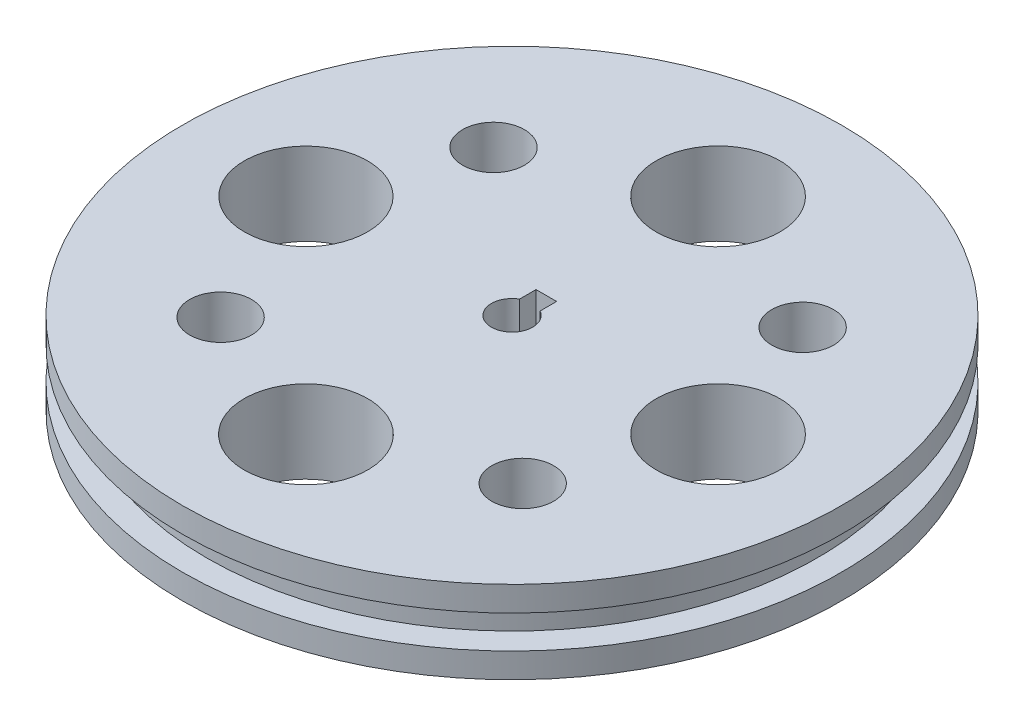
ISO-10303-21;
HEADER;
FILE_DESCRIPTION(('STEP AP214'),'2;1');
FILE_NAME('part.step','',(''),(''),'','','');
FILE_SCHEMA(('AUTOMOTIVE_DESIGN { 1 0 10303 214 1 1 1 1 }'));
ENDSEC;
DATA;
#1=APPLICATION_CONTEXT('core data for automotive mechanical design processes');
#2=APPLICATION_PROTOCOL_DEFINITION('international standard','automotive_design',2000,#1);
#3=PRODUCT_CONTEXT('',#1,'mechanical');
#4=PRODUCT('Part','Part','',(#3));
#5=PRODUCT_RELATED_PRODUCT_CATEGORY('part','',(#4));
#6=PRODUCT_DEFINITION_FORMATION('','',#4);
#7=PRODUCT_DEFINITION_CONTEXT('part definition',#1,'design');
#8=PRODUCT_DEFINITION('design','',#6,#7);
#9=PRODUCT_DEFINITION_SHAPE('','',#8);
#10=(LENGTH_UNIT() NAMED_UNIT(*) SI_UNIT(.MILLI.,.METRE.));
#11=(NAMED_UNIT(*) PLANE_ANGLE_UNIT() SI_UNIT($,.RADIAN.));
#12=(NAMED_UNIT(*) SI_UNIT($,.STERADIAN.) SOLID_ANGLE_UNIT());
#13=UNCERTAINTY_MEASURE_WITH_UNIT(LENGTH_MEASURE(1.E-05),#10,'distance_accuracy_value','');
#14=(GEOMETRIC_REPRESENTATION_CONTEXT(3) GLOBAL_UNCERTAINTY_ASSIGNED_CONTEXT((#13)) GLOBAL_UNIT_ASSIGNED_CONTEXT((#10,
#11,#12)) REPRESENTATION_CONTEXT('',''));
#15=CARTESIAN_POINT('',(0.,0.,0.));
#16=DIRECTION('',(0.,0.,1.));
#17=DIRECTION('',(1.,0.,0.));
#18=AXIS2_PLACEMENT_3D('',#15,#16,#17);
#19=CARTESIAN_POINT('',(0.,0.,0.));
#20=DIRECTION('',(0.,1.,0.));
#21=DIRECTION('',(0.,0.,1.));
#22=AXIS2_PLACEMENT_3D('',#19,#20,#21);
#23=PLANE('',#22);
#24=CARTESIAN_POINT('',(-44.3867054724508,0.,45.4100250748875));
#25=DIRECTION('',(0.,1.,0.));
#26=DIRECTION('',(0.,0.,1.));
#27=AXIS2_PLACEMENT_3D('',#24,#25,#26);
#28=CIRCLE('',#27,9.525);
#29=CARTESIAN_POINT('',(-44.3867054724508,0.,54.9350250748874));
#30=VERTEX_POINT('',#29);
#31=EDGE_CURVE('E148',#30,#30,#28,.T.);
#32=ORIENTED_EDGE('',*,*,#31,.T.);
#33=EDGE_LOOP('',(#32));
#34=FACE_BOUND('',#33,.T.);
#35=CARTESIAN_POINT('',(0.,0.,63.5));
#36=DIRECTION('',(0.,1.,0.));
#37=DIRECTION('',(0.,0.,1.));
#38=AXIS2_PLACEMENT_3D('',#35,#36,#37);
#39=CIRCLE('',#38,19.05);
#40=CARTESIAN_POINT('',(0.,0.,82.55));
#41=VERTEX_POINT('',#40);
#42=EDGE_CURVE('E142',#41,#41,#39,.T.);
#43=ORIENTED_EDGE('',*,*,#42,.T.);
#44=EDGE_LOOP('',(#43));
#45=FACE_BOUND('',#44,.T.);
#46=DIRECTION('',(1.,0.,0.));
#47=VECTOR('',#46,1.);
#48=CARTESIAN_POINT('',(-3.17500000000001,0.,-10.5808965722947));
#49=LINE('',#48,#47);
#50=CARTESIAN_POINT('',(-3.17500000000001,0.,-10.5808965722947));
#51=VERTEX_POINT('',#50);
#52=CARTESIAN_POINT('',(3.17499999999999,0.,-10.5808965722947));
#53=VERTEX_POINT('',#52);
#54=EDGE_CURVE('E131',#51,#53,#49,.T.);
#55=ORIENTED_EDGE('',*,*,#54,.F.);
#56=DIRECTION('',(0.,0.,1.));
#57=VECTOR('',#56,1.);
#58=CARTESIAN_POINT('',(-3.17500000000001,0.,-10.5808965722947));
#59=LINE('',#58,#57);
#60=CARTESIAN_POINT('',(-3.17500000000001,0.,-5.49926131403118));
#61=VERTEX_POINT('',#60);
#62=EDGE_CURVE('E115',#51,#61,#59,.T.);
#63=ORIENTED_EDGE('',*,*,#62,.T.);
#64=CARTESIAN_POINT('',(0.,0.,0.));
#65=DIRECTION('',(0.,1.,0.));
#66=DIRECTION('',(0.,0.,1.));
#67=AXIS2_PLACEMENT_3D('',#64,#65,#66);
#68=CIRCLE('',#67,6.35);
#69=CARTESIAN_POINT('',(3.17499999999999,0.,-5.49926131403119));
#70=VERTEX_POINT('',#69);
#71=EDGE_CURVE('E124',#61,#70,#68,.T.);
#72=ORIENTED_EDGE('',*,*,#71,.T.);
#73=DIRECTION('',(0.,0.,1.));
#74=VECTOR('',#73,1.);
#75=CARTESIAN_POINT('',(3.17499999999999,0.,-10.5808965722947));
#76=LINE('',#75,#74);
#77=EDGE_CURVE('E86',#53,#70,#76,.T.);
#78=ORIENTED_EDGE('',*,*,#77,.F.);
#79=EDGE_LOOP('',(#55,#63,#72,#78));
#80=FACE_BOUND('',#79,.T.);
#81=CARTESIAN_POINT('',(47.9972072686744,0.,-41.5754506218262));
#82=DIRECTION('',(0.,1.,0.));
#83=DIRECTION('',(0.,0.,1.));
#84=AXIS2_PLACEMENT_3D('',#81,#82,#83);
#85=CIRCLE('',#84,9.525);
#86=CARTESIAN_POINT('',(47.9972072686744,0.,-32.0504506218263));
#87=VERTEX_POINT('',#86);
#88=EDGE_CURVE('E305',#87,#87,#85,.T.);
#89=ORIENTED_EDGE('',*,*,#88,.T.);
#90=EDGE_LOOP('',(#89));
#91=FACE_BOUND('',#90,.T.);
#92=CARTESIAN_POINT('',(63.5,0.,0.));
#93=DIRECTION('',(0.,1.,0.));
#94=DIRECTION('',(0.,0.,1.));
#95=AXIS2_PLACEMENT_3D('',#92,#93,#94);
#96=CIRCLE('',#95,19.05);
#97=CARTESIAN_POINT('',(63.5,0.,19.05));
#98=VERTEX_POINT('',#97);
#99=EDGE_CURVE('E173',#98,#98,#96,.T.);
#100=ORIENTED_EDGE('',*,*,#99,.T.);
#101=EDGE_LOOP('',(#100));
#102=FACE_BOUND('',#101,.T.);
#103=CARTESIAN_POINT('',(-63.5,0.,0.));
#104=DIRECTION('',(0.,1.,0.));
#105=DIRECTION('',(0.,0.,1.));
#106=AXIS2_PLACEMENT_3D('',#103,#104,#105);
#107=CIRCLE('',#106,18.9883305788282);
#108=CARTESIAN_POINT('',(-63.5,0.,18.9883305788282));
#109=VERTEX_POINT('',#108);
#110=EDGE_CURVE('E167',#109,#109,#107,.T.);
#111=ORIENTED_EDGE('',*,*,#110,.T.);
#112=EDGE_LOOP('',(#111));
#113=FACE_BOUND('',#112,.T.);
#114=CARTESIAN_POINT('',(-47.6598592977243,0.,-41.9617422388671));
#115=DIRECTION('',(0.,1.,0.));
#116=DIRECTION('',(0.,0.,1.));
#117=AXIS2_PLACEMENT_3D('',#114,#115,#116);
#118=CIRCLE('',#117,9.525);
#119=CARTESIAN_POINT('',(-47.6598592977243,0.,-32.4367422388671));
#120=VERTEX_POINT('',#119);
#121=EDGE_CURVE('E161',#120,#120,#118,.T.);
#122=ORIENTED_EDGE('',*,*,#121,.T.);
#123=EDGE_LOOP('',(#122));
#124=FACE_BOUND('',#123,.T.);
#125=CARTESIAN_POINT('',(0.,0.,-63.5));
#126=DIRECTION('',(0.,1.,0.));
#127=DIRECTION('',(0.,0.,1.));
#128=AXIS2_PLACEMENT_3D('',#125,#126,#127);
#129=CIRCLE('',#128,19.05);
#130=CARTESIAN_POINT('',(0.,0.,-44.45));
#131=VERTEX_POINT('',#130);
#132=EDGE_CURVE('E155',#131,#131,#129,.T.);
#133=ORIENTED_EDGE('',*,*,#132,.T.);
#134=EDGE_LOOP('',(#133));
#135=FACE_BOUND('',#134,.T.);
#136=CARTESIAN_POINT('',(46.5214875325729,0.,43.2203794263385));
#137=DIRECTION('',(0.,1.,0.));
#138=DIRECTION('',(0.,0.,1.));
#139=AXIS2_PLACEMENT_3D('',#136,#137,#138);
#140=CIRCLE('',#139,9.5250000000001);
#141=CARTESIAN_POINT('',(46.5214875325729,0.,52.7453794263386));
#142=VERTEX_POINT('',#141);
#143=EDGE_CURVE('E177',#142,#142,#140,.T.);
#144=ORIENTED_EDGE('',*,*,#143,.T.);
#145=EDGE_LOOP('',(#144));
#146=FACE_BOUND('',#145,.T.);
#147=CARTESIAN_POINT('',(0.,0.,0.));
#148=DIRECTION('',(0.,1.,0.));
#149=DIRECTION('',(0.,0.,1.));
#150=AXIS2_PLACEMENT_3D('',#147,#148,#149);
#151=CIRCLE('',#150,101.558930414115);
#152=CARTESIAN_POINT('',(0.,0.,101.558930414115));
#153=VERTEX_POINT('',#152);
#154=EDGE_CURVE('E12',#153,#153,#151,.T.);
#155=ORIENTED_EDGE('',*,*,#154,.F.);
#156=EDGE_LOOP('',(#155));
#157=FACE_BOUND('',#156,.T.);
#158=ADVANCED_FACE('F72',(#34,#45,#80,#91,#102,#113,#124,#135,#146,#157),#23,.F.);
#159=CARTESIAN_POINT('',(0.,25.4486414958803,0.));
#160=DIRECTION('',(0.,1.,0.));
#161=DIRECTION('',(0.,0.,1.));
#162=AXIS2_PLACEMENT_3D('',#159,#160,#161);
#163=CYLINDRICAL_SURFACE('',#162,101.558930414115);
#164=CARTESIAN_POINT('',(0.,7.65815600570473,0.));
#165=DIRECTION('',(0.,1.,0.));
#166=DIRECTION('',(0.,0.,1.));
#167=AXIS2_PLACEMENT_3D('',#164,#165,#166);
#168=CIRCLE('',#167,101.558930414115);
#169=CARTESIAN_POINT('',(0.,7.65815600570473,101.558930414115));
#170=VERTEX_POINT('',#169);
#171=EDGE_CURVE('E79',#170,#170,#168,.T.);
#172=ORIENTED_EDGE('',*,*,#171,.F.);
#173=EDGE_LOOP('',(#172));
#174=FACE_BOUND('',#173,.T.);
#175=ORIENTED_EDGE('',*,*,#154,.T.);
#176=EDGE_LOOP('',(#175));
#177=FACE_BOUND('',#176,.T.);
#178=ADVANCED_FACE('F198',(#174,#177),#163,.T.);
#179=CARTESIAN_POINT('',(101.558930414115,7.65815600570473,0.));
#180=DIRECTION('',(0.,-1.,0.));
#181=DIRECTION('',(0.,0.,-1.));
#182=AXIS2_PLACEMENT_3D('',#179,#180,#181);
#183=PLANE('',#182);
#184=CARTESIAN_POINT('',(0.,7.65815600570473,0.));
#185=DIRECTION('',(0.,1.,0.));
#186=DIRECTION('',(0.,0.,1.));
#187=AXIS2_PLACEMENT_3D('',#184,#185,#186);
#188=CIRCLE('',#187,94.0185921931134);
#189=CARTESIAN_POINT('',(0.,7.65815600570473,94.0185921931134));
#190=VERTEX_POINT('',#189);
#191=EDGE_CURVE('E191',#190,#190,#188,.T.);
#192=ORIENTED_EDGE('',*,*,#191,.F.);
#193=EDGE_LOOP('',(#192));
#194=FACE_BOUND('',#193,.T.);
#195=ORIENTED_EDGE('',*,*,#171,.T.);
#196=EDGE_LOOP('',(#195));
#197=FACE_BOUND('',#196,.T.);
#198=ADVANCED_FACE('F196',(#194,#197),#183,.F.);
#199=CARTESIAN_POINT('',(0.,25.4486414958803,0.));
#200=DIRECTION('',(0.,1.,0.));
#201=DIRECTION('',(0.,0.,1.));
#202=AXIS2_PLACEMENT_3D('',#199,#200,#201);
#203=CYLINDRICAL_SURFACE('',#202,94.0185921931134);
#204=CARTESIAN_POINT('',(0.,17.7904854901756,0.));
#205=DIRECTION('',(0.,1.,0.));
#206=DIRECTION('',(0.,0.,1.));
#207=AXIS2_PLACEMENT_3D('',#204,#205,#206);
#208=CIRCLE('',#207,94.0185921931134);
#209=CARTESIAN_POINT('',(0.,17.7904854901756,94.0185921931134));
#210=VERTEX_POINT('',#209);
#211=EDGE_CURVE('E188',#210,#210,#208,.T.);
#212=ORIENTED_EDGE('',*,*,#211,.F.);
#213=EDGE_LOOP('',(#212));
#214=FACE_BOUND('',#213,.T.);
#215=ORIENTED_EDGE('',*,*,#191,.T.);
#216=EDGE_LOOP('',(#215));
#217=FACE_BOUND('',#216,.T.);
#218=ADVANCED_FACE('F250',(#214,#217),#203,.T.);
#219=CARTESIAN_POINT('',(94.0185921931134,17.7904854901756,0.));
#220=DIRECTION('',(0.,1.,0.));
#221=DIRECTION('',(0.,0.,1.));
#222=AXIS2_PLACEMENT_3D('',#219,#220,#221);
#223=PLANE('',#222);
#224=CARTESIAN_POINT('',(0.,17.7904854901756,0.));
#225=DIRECTION('',(0.,1.,0.));
#226=DIRECTION('',(0.,0.,1.));
#227=AXIS2_PLACEMENT_3D('',#224,#225,#226);
#228=CIRCLE('',#227,101.558930414115);
#229=CARTESIAN_POINT('',(0.,17.7904854901756,101.558930414115));
#230=VERTEX_POINT('',#229);
#231=EDGE_CURVE('E185',#230,#230,#228,.T.);
#232=ORIENTED_EDGE('',*,*,#231,.F.);
#233=EDGE_LOOP('',(#232));
#234=FACE_BOUND('',#233,.T.);
#235=ORIENTED_EDGE('',*,*,#211,.T.);
#236=EDGE_LOOP('',(#235));
#237=FACE_BOUND('',#236,.T.);
#238=ADVANCED_FACE('F244',(#234,#237),#223,.F.);
#239=CARTESIAN_POINT('',(0.,25.4486414958803,0.));
#240=DIRECTION('',(0.,1.,0.));
#241=DIRECTION('',(0.,0.,1.));
#242=AXIS2_PLACEMENT_3D('',#239,#240,#241);
#243=CYLINDRICAL_SURFACE('',#242,101.558930414115);
#244=CARTESIAN_POINT('',(0.,25.4486414958803,0.));
#245=DIRECTION('',(0.,1.,0.));
#246=DIRECTION('',(0.,0.,1.));
#247=AXIS2_PLACEMENT_3D('',#244,#245,#246);
#248=CIRCLE('',#247,101.558930414115);
#249=CARTESIAN_POINT('',(0.,25.4486414958803,101.558930414115));
#250=VERTEX_POINT('',#249);
#251=EDGE_CURVE('E180',#250,#250,#248,.T.);
#252=ORIENTED_EDGE('',*,*,#251,.F.);
#253=EDGE_LOOP('',(#252));
#254=FACE_BOUND('',#253,.T.);
#255=ORIENTED_EDGE('',*,*,#231,.T.);
#256=EDGE_LOOP('',(#255));
#257=FACE_BOUND('',#256,.T.);
#258=ADVANCED_FACE('F222',(#254,#257),#243,.T.);
#259=CARTESIAN_POINT('',(101.558930414115,25.4486414958803,0.));
#260=DIRECTION('',(0.,-1.,0.));
#261=DIRECTION('',(0.,0.,-1.));
#262=AXIS2_PLACEMENT_3D('',#259,#260,#261);
#263=PLANE('',#262);
#264=CARTESIAN_POINT('',(-44.3867054724508,25.4486414958803,45.4100250748875));
#265=DIRECTION('',(0.,1.,0.));
#266=DIRECTION('',(0.,0.,1.));
#267=AXIS2_PLACEMENT_3D('',#264,#265,#266);
#268=CIRCLE('',#267,9.525);
#269=CARTESIAN_POINT('',(-44.3867054724508,25.4486414958803,54.9350250748874));
#270=VERTEX_POINT('',#269);
#271=EDGE_CURVE('E145',#270,#270,#268,.T.);
#272=ORIENTED_EDGE('',*,*,#271,.F.);
#273=EDGE_LOOP('',(#272));
#274=FACE_BOUND('',#273,.T.);
#275=CARTESIAN_POINT('',(0.,25.4486414958803,63.5));
#276=DIRECTION('',(0.,1.,0.));
#277=DIRECTION('',(0.,0.,1.));
#278=AXIS2_PLACEMENT_3D('',#275,#276,#277);
#279=CIRCLE('',#278,19.05);
#280=CARTESIAN_POINT('',(0.,25.4486414958803,82.55));
#281=VERTEX_POINT('',#280);
#282=EDGE_CURVE('E139',#281,#281,#279,.T.);
#283=ORIENTED_EDGE('',*,*,#282,.F.);
#284=EDGE_LOOP('',(#283));
#285=FACE_BOUND('',#284,.T.);
#286=CARTESIAN_POINT('',(0.,25.4486414958803,0.));
#287=DIRECTION('',(0.,1.,0.));
#288=DIRECTION('',(0.,0.,1.));
#289=AXIS2_PLACEMENT_3D('',#286,#287,#288);
#290=CIRCLE('',#289,6.35);
#291=CARTESIAN_POINT('',(-3.17500000000001,25.4486414958803,-5.49926131403118));
#292=VERTEX_POINT('',#291);
#293=CARTESIAN_POINT('',(3.17499999999999,25.4486414958803,-5.49926131403119));
#294=VERTEX_POINT('',#293);
#295=EDGE_CURVE('E127',#292,#294,#290,.T.);
#296=ORIENTED_EDGE('',*,*,#295,.F.);
#297=DIRECTION('',(0.,0.,1.));
#298=VECTOR('',#297,1.);
#299=CARTESIAN_POINT('',(-3.17500000000001,25.4486414958803,-10.5808965722947));
#300=LINE('',#299,#298);
#301=CARTESIAN_POINT('',(-3.17500000000001,25.4486414958803,-10.5808965722947));
#302=VERTEX_POINT('',#301);
#303=EDGE_CURVE('E94',#302,#292,#300,.T.);
#304=ORIENTED_EDGE('',*,*,#303,.F.);
#305=DIRECTION('',(1.,0.,0.));
#306=VECTOR('',#305,1.);
#307=CARTESIAN_POINT('',(-3.17500000000001,25.4486414958803,-10.5808965722947));
#308=LINE('',#307,#306);
#309=CARTESIAN_POINT('',(3.17499999999999,25.4486414958803,-10.5808965722947));
#310=VERTEX_POINT('',#309);
#311=EDGE_CURVE('E133',#302,#310,#308,.T.);
#312=ORIENTED_EDGE('',*,*,#311,.T.);
#313=DIRECTION('',(0.,0.,1.));
#314=VECTOR('',#313,1.);
#315=CARTESIAN_POINT('',(3.17499999999999,25.4486414958803,-10.5808965722947));
#316=LINE('',#315,#314);
#317=EDGE_CURVE('E128',#310,#294,#316,.T.);
#318=ORIENTED_EDGE('',*,*,#317,.T.);
#319=EDGE_LOOP('',(#296,#304,#312,#318));
#320=FACE_BOUND('',#319,.T.);
#321=CARTESIAN_POINT('',(47.9972072686744,25.4486414958803,-41.5754506218262));
#322=DIRECTION('',(0.,1.,0.));
#323=DIRECTION('',(0.,0.,1.));
#324=AXIS2_PLACEMENT_3D('',#321,#322,#323);
#325=CIRCLE('',#324,9.525);
#326=CARTESIAN_POINT('',(47.9972072686744,25.4486414958803,-32.0504506218263));
#327=VERTEX_POINT('',#326);
#328=EDGE_CURVE('E176',#327,#327,#325,.T.);
#329=ORIENTED_EDGE('',*,*,#328,.F.);
#330=EDGE_LOOP('',(#329));
#331=FACE_BOUND('',#330,.T.);
#332=CARTESIAN_POINT('',(63.5,25.4486414958803,0.));
#333=DIRECTION('',(0.,1.,0.));
#334=DIRECTION('',(0.,0.,1.));
#335=AXIS2_PLACEMENT_3D('',#332,#333,#334);
#336=CIRCLE('',#335,19.05);
#337=CARTESIAN_POINT('',(63.5,25.4486414958803,19.05));
#338=VERTEX_POINT('',#337);
#339=EDGE_CURVE('E170',#338,#338,#336,.T.);
#340=ORIENTED_EDGE('',*,*,#339,.F.);
#341=EDGE_LOOP('',(#340));
#342=FACE_BOUND('',#341,.T.);
#343=CARTESIAN_POINT('',(-63.5,25.4486414958803,0.));
#344=DIRECTION('',(0.,1.,0.));
#345=DIRECTION('',(0.,0.,1.));
#346=AXIS2_PLACEMENT_3D('',#343,#344,#345);
#347=CIRCLE('',#346,18.9883305788282);
#348=CARTESIAN_POINT('',(-63.5,25.4486414958803,18.9883305788282));
#349=VERTEX_POINT('',#348);
#350=EDGE_CURVE('E164',#349,#349,#347,.T.);
#351=ORIENTED_EDGE('',*,*,#350,.F.);
#352=EDGE_LOOP('',(#351));
#353=FACE_BOUND('',#352,.T.);
#354=CARTESIAN_POINT('',(-47.6598592977243,25.4486414958803,-41.9617422388671));
#355=DIRECTION('',(0.,1.,0.));
#356=DIRECTION('',(0.,0.,1.));
#357=AXIS2_PLACEMENT_3D('',#354,#355,#356);
#358=CIRCLE('',#357,9.525);
#359=CARTESIAN_POINT('',(-47.6598592977243,25.4486414958803,-32.4367422388671));
#360=VERTEX_POINT('',#359);
#361=EDGE_CURVE('E158',#360,#360,#358,.T.);
#362=ORIENTED_EDGE('',*,*,#361,.F.);
#363=EDGE_LOOP('',(#362));
#364=FACE_BOUND('',#363,.T.);
#365=CARTESIAN_POINT('',(0.,25.4486414958803,-63.5));
#366=DIRECTION('',(0.,1.,0.));
#367=DIRECTION('',(0.,0.,1.));
#368=AXIS2_PLACEMENT_3D('',#365,#366,#367);
#369=CIRCLE('',#368,19.05);
#370=CARTESIAN_POINT('',(0.,25.4486414958803,-44.45));
#371=VERTEX_POINT('',#370);
#372=EDGE_CURVE('E151',#371,#371,#369,.T.);
#373=ORIENTED_EDGE('',*,*,#372,.F.);
#374=EDGE_LOOP('',(#373));
#375=FACE_BOUND('',#374,.T.);
#376=CARTESIAN_POINT('',(46.5214875325729,25.4486414958803,43.2203794263385));
#377=DIRECTION('',(0.,1.,0.));
#378=DIRECTION('',(0.,0.,1.));
#379=AXIS2_PLACEMENT_3D('',#376,#377,#378);
#380=CIRCLE('',#379,9.5250000000001);
#381=CARTESIAN_POINT('',(46.5214875325729,25.4486414958803,52.7453794263386));
#382=VERTEX_POINT('',#381);
#383=EDGE_CURVE('E154',#382,#382,#380,.T.);
#384=ORIENTED_EDGE('',*,*,#383,.F.);
#385=EDGE_LOOP('',(#384));
#386=FACE_BOUND('',#385,.T.);
#387=ORIENTED_EDGE('',*,*,#251,.T.);
#388=EDGE_LOOP('',(#387));
#389=FACE_BOUND('',#388,.T.);
#390=ADVANCED_FACE('F218',(#274,#285,#320,#331,#342,#353,#364,#375,#386,#389),#263,.F.);
#391=CARTESIAN_POINT('',(46.5214875325729,0.,43.2203794263385));
#392=DIRECTION('',(0.,1.,0.));
#393=DIRECTION('',(0.,0.,1.));
#394=AXIS2_PLACEMENT_3D('',#391,#392,#393);
#395=CYLINDRICAL_SURFACE('',#394,9.5250000000001);
#396=ORIENTED_EDGE('',*,*,#383,.T.);
#397=EDGE_LOOP('',(#396));
#398=FACE_BOUND('',#397,.T.);
#399=ORIENTED_EDGE('',*,*,#143,.F.);
#400=EDGE_LOOP('',(#399));
#401=FACE_BOUND('',#400,.T.);
#402=ADVANCED_FACE('F221',(#398,#401),#395,.F.);
#403=CARTESIAN_POINT('',(0.,0.,-63.5));
#404=DIRECTION('',(0.,1.,0.));
#405=DIRECTION('',(0.,0.,1.));
#406=AXIS2_PLACEMENT_3D('',#403,#404,#405);
#407=CYLINDRICAL_SURFACE('',#406,19.05);
#408=ORIENTED_EDGE('',*,*,#132,.F.);
#409=EDGE_LOOP('',(#408));
#410=FACE_BOUND('',#409,.T.);
#411=ORIENTED_EDGE('',*,*,#372,.T.);
#412=EDGE_LOOP('',(#411));
#413=FACE_BOUND('',#412,.T.);
#414=ADVANCED_FACE('F266',(#410,#413),#407,.F.);
#415=CARTESIAN_POINT('',(-47.6598592977243,0.,-41.9617422388671));
#416=DIRECTION('',(0.,1.,0.));
#417=DIRECTION('',(0.,0.,1.));
#418=AXIS2_PLACEMENT_3D('',#415,#416,#417);
#419=CYLINDRICAL_SURFACE('',#418,9.525);
#420=ORIENTED_EDGE('',*,*,#121,.F.);
#421=EDGE_LOOP('',(#420));
#422=FACE_BOUND('',#421,.T.);
#423=ORIENTED_EDGE('',*,*,#361,.T.);
#424=EDGE_LOOP('',(#423));
#425=FACE_BOUND('',#424,.T.);
#426=ADVANCED_FACE('F276',(#422,#425),#419,.F.);
#427=CARTESIAN_POINT('',(-63.5,0.,0.));
#428=DIRECTION('',(0.,1.,0.));
#429=DIRECTION('',(0.,0.,1.));
#430=AXIS2_PLACEMENT_3D('',#427,#428,#429);
#431=CYLINDRICAL_SURFACE('',#430,18.9883305788282);
#432=ORIENTED_EDGE('',*,*,#110,.F.);
#433=EDGE_LOOP('',(#432));
#434=FACE_BOUND('',#433,.T.);
#435=ORIENTED_EDGE('',*,*,#350,.T.);
#436=EDGE_LOOP('',(#435));
#437=FACE_BOUND('',#436,.T.);
#438=ADVANCED_FACE('F272',(#434,#437),#431,.F.);
#439=CARTESIAN_POINT('',(63.5,0.,0.));
#440=DIRECTION('',(0.,1.,0.));
#441=DIRECTION('',(0.,0.,1.));
#442=AXIS2_PLACEMENT_3D('',#439,#440,#441);
#443=CYLINDRICAL_SURFACE('',#442,19.05);
#444=ORIENTED_EDGE('',*,*,#99,.F.);
#445=EDGE_LOOP('',(#444));
#446=FACE_BOUND('',#445,.T.);
#447=ORIENTED_EDGE('',*,*,#339,.T.);
#448=EDGE_LOOP('',(#447));
#449=FACE_BOUND('',#448,.T.);
#450=ADVANCED_FACE('F268',(#446,#449),#443,.F.);
#451=CARTESIAN_POINT('',(47.9972072686744,0.,-41.5754506218262));
#452=DIRECTION('',(0.,1.,0.));
#453=DIRECTION('',(0.,0.,1.));
#454=AXIS2_PLACEMENT_3D('',#451,#452,#453);
#455=CYLINDRICAL_SURFACE('',#454,9.525);
#456=ORIENTED_EDGE('',*,*,#88,.F.);
#457=EDGE_LOOP('',(#456));
#458=FACE_BOUND('',#457,.T.);
#459=ORIENTED_EDGE('',*,*,#328,.T.);
#460=EDGE_LOOP('',(#459));
#461=FACE_BOUND('',#460,.T.);
#462=ADVANCED_FACE('F271',(#458,#461),#455,.F.);
#463=CARTESIAN_POINT('',(-3.17500000000001,0.,-10.5808965722947));
#464=DIRECTION('',(-1.,0.,0.));
#465=DIRECTION('',(0.,0.,1.));
#466=AXIS2_PLACEMENT_3D('',#463,#464,#465);
#467=PLANE('',#466);
#468=DIRECTION('',(0.,1.,0.));
#469=VECTOR('',#468,1.);
#470=CARTESIAN_POINT('',(-3.17500000000001,0.,-5.49926131403118));
#471=LINE('',#470,#469);
#472=EDGE_CURVE('E111',#292,#61,#471,.F.);
#473=ORIENTED_EDGE('',*,*,#472,.T.);
#474=ORIENTED_EDGE('',*,*,#62,.F.);
#475=DIRECTION('',(0.,1.,0.));
#476=VECTOR('',#475,1.);
#477=CARTESIAN_POINT('',(-3.17500000000001,0.,-10.5808965722947));
#478=LINE('',#477,#476);
#479=EDGE_CURVE('E120',#51,#302,#478,.T.);
#480=ORIENTED_EDGE('',*,*,#479,.T.);
#481=ORIENTED_EDGE('',*,*,#303,.T.);
#482=EDGE_LOOP('',(#473,#474,#480,#481));
#483=FACE_BOUND('',#482,.T.);
#484=ADVANCED_FACE('F113',(#483),#467,.F.);
#485=CARTESIAN_POINT('',(-3.17500000000001,0.,-10.5808965722947));
#486=DIRECTION('',(0.,0.,1.));
#487=DIRECTION('',(1.,0.,0.));
#488=AXIS2_PLACEMENT_3D('',#485,#486,#487);
#489=PLANE('',#488);
#490=ORIENTED_EDGE('',*,*,#311,.F.);
#491=ORIENTED_EDGE('',*,*,#479,.F.);
#492=ORIENTED_EDGE('',*,*,#54,.T.);
#493=DIRECTION('',(0.,1.,0.));
#494=VECTOR('',#493,1.);
#495=CARTESIAN_POINT('',(3.17499999999999,0.,-10.5808965722947));
#496=LINE('',#495,#494);
#497=EDGE_CURVE('E135',#53,#310,#496,.T.);
#498=ORIENTED_EDGE('',*,*,#497,.T.);
#499=EDGE_LOOP('',(#490,#491,#492,#498));
#500=FACE_BOUND('',#499,.T.);
#501=ADVANCED_FACE('F287',(#500),#489,.T.);
#502=CARTESIAN_POINT('',(3.17499999999999,0.,-10.5808965722947));
#503=DIRECTION('',(-1.,0.,0.));
#504=DIRECTION('',(0.,0.,1.));
#505=AXIS2_PLACEMENT_3D('',#502,#503,#504);
#506=PLANE('',#505);
#507=ORIENTED_EDGE('',*,*,#317,.F.);
#508=ORIENTED_EDGE('',*,*,#497,.F.);
#509=ORIENTED_EDGE('',*,*,#77,.T.);
#510=DIRECTION('',(0.,1.,0.));
#511=VECTOR('',#510,1.);
#512=CARTESIAN_POINT('',(3.17499999999999,0.,-5.49926131403119));
#513=LINE('',#512,#511);
#514=EDGE_CURVE('E121',#294,#70,#513,.F.);
#515=ORIENTED_EDGE('',*,*,#514,.F.);
#516=EDGE_LOOP('',(#507,#508,#509,#515));
#517=FACE_BOUND('',#516,.T.);
#518=ADVANCED_FACE('F290',(#517),#506,.T.);
#519=CARTESIAN_POINT('',(0.,0.,0.));
#520=DIRECTION('',(0.,1.,0.));
#521=DIRECTION('',(0.,0.,1.));
#522=AXIS2_PLACEMENT_3D('',#519,#520,#521);
#523=CYLINDRICAL_SURFACE('',#522,6.35);
#524=ORIENTED_EDGE('',*,*,#514,.T.);
#525=ORIENTED_EDGE('',*,*,#71,.F.);
#526=ORIENTED_EDGE('',*,*,#472,.F.);
#527=ORIENTED_EDGE('',*,*,#295,.T.);
#528=EDGE_LOOP('',(#524,#525,#526,#527));
#529=FACE_BOUND('',#528,.T.);
#530=ADVANCED_FACE('F125',(#529),#523,.F.);
#531=CARTESIAN_POINT('',(0.,0.,63.5));
#532=DIRECTION('',(0.,1.,0.));
#533=DIRECTION('',(0.,0.,1.));
#534=AXIS2_PLACEMENT_3D('',#531,#532,#533);
#535=CYLINDRICAL_SURFACE('',#534,19.05);
#536=ORIENTED_EDGE('',*,*,#42,.F.);
#537=EDGE_LOOP('',(#536));
#538=FACE_BOUND('',#537,.T.);
#539=ORIENTED_EDGE('',*,*,#282,.T.);
#540=EDGE_LOOP('',(#539));
#541=FACE_BOUND('',#540,.T.);
#542=ADVANCED_FACE('F211',(#538,#541),#535,.F.);
#543=CARTESIAN_POINT('',(-44.3867054724508,0.,45.4100250748875));
#544=DIRECTION('',(0.,1.,0.));
#545=DIRECTION('',(0.,0.,1.));
#546=AXIS2_PLACEMENT_3D('',#543,#544,#545);
#547=CYLINDRICAL_SURFACE('',#546,9.525);
#548=ORIENTED_EDGE('',*,*,#271,.T.);
#549=EDGE_LOOP('',(#548));
#550=FACE_BOUND('',#549,.T.);
#551=ORIENTED_EDGE('',*,*,#31,.F.);
#552=EDGE_LOOP('',(#551));
#553=FACE_BOUND('',#552,.T.);
#554=ADVANCED_FACE('F214',(#550,#553),#547,.F.);
#555=CLOSED_SHELL('',(#158,#178,#198,#218,#238,#258,#390,#402,#414,#426,#438,#450,#462,#484,
#501,#518,#530,#542,#554));
#556=MANIFOLD_SOLID_BREP('B2',#555);
#557=ADVANCED_BREP_SHAPE_REPRESENTATION('',(#18,#556),#14);
#558=SHAPE_DEFINITION_REPRESENTATION(#9,#557);
ENDSEC;
END-ISO-10303-21;
